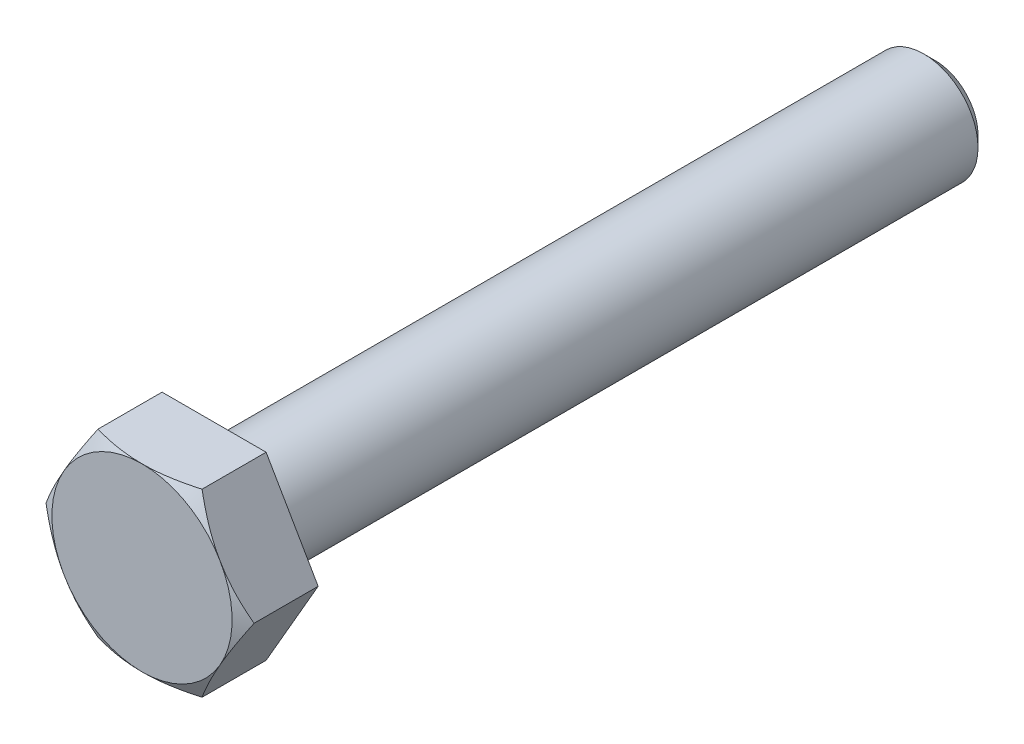
ISO-10303-21;
HEADER;
FILE_DESCRIPTION(('STEP AP214'),'2;1');
FILE_NAME('part.step','',(''),(''),'','','');
FILE_SCHEMA(('AUTOMOTIVE_DESIGN { 1 0 10303 214 1 1 1 1 }'));
ENDSEC;
DATA;
#1=APPLICATION_CONTEXT('core data for automotive mechanical design processes');
#2=APPLICATION_PROTOCOL_DEFINITION('international standard','automotive_design',2000,#1);
#3=PRODUCT_CONTEXT('',#1,'mechanical');
#4=PRODUCT('Part','Part','',(#3));
#5=PRODUCT_RELATED_PRODUCT_CATEGORY('part','',(#4));
#6=PRODUCT_DEFINITION_FORMATION('','',#4);
#7=PRODUCT_DEFINITION_CONTEXT('part definition',#1,'design');
#8=PRODUCT_DEFINITION('design','',#6,#7);
#9=PRODUCT_DEFINITION_SHAPE('','',#8);
#10=(LENGTH_UNIT() NAMED_UNIT(*) SI_UNIT(.MILLI.,.METRE.));
#11=(NAMED_UNIT(*) PLANE_ANGLE_UNIT() SI_UNIT($,.RADIAN.));
#12=(NAMED_UNIT(*) SI_UNIT($,.STERADIAN.) SOLID_ANGLE_UNIT());
#13=UNCERTAINTY_MEASURE_WITH_UNIT(LENGTH_MEASURE(1.E-05),#10,'distance_accuracy_value','');
#14=(GEOMETRIC_REPRESENTATION_CONTEXT(3) GLOBAL_UNCERTAINTY_ASSIGNED_CONTEXT((#13)) GLOBAL_UNIT_ASSIGNED_CONTEXT((#10,
#11,#12)) REPRESENTATION_CONTEXT('',''));
#15=CARTESIAN_POINT('',(0.,0.,0.));
#16=DIRECTION('',(0.,0.,1.));
#17=DIRECTION('',(1.,0.,0.));
#18=AXIS2_PLACEMENT_3D('',#15,#16,#17);
#19=CARTESIAN_POINT('',(-8.66025403784437,-5.,0.));
#20=DIRECTION('',(0.,0.,1.));
#21=DIRECTION('',(1.,0.,0.));
#22=AXIS2_PLACEMENT_3D('',#19,#20,#21);
#23=PLANE('',#22);
#24=CARTESIAN_POINT('',(0.,0.,0.));
#25=DIRECTION('',(0.,0.,1.));
#26=DIRECTION('',(1.,0.,0.));
#27=AXIS2_PLACEMENT_3D('',#24,#25,#26);
#28=CIRCLE('',#27,3.25);
#29=CARTESIAN_POINT('',(3.25,0.,0.));
#30=VERTEX_POINT('',#29);
#31=EDGE_CURVE('E11',#30,#30,#28,.T.);
#32=ORIENTED_EDGE('',*,*,#31,.T.);
#33=EDGE_LOOP('',(#32));
#34=FACE_BOUND('',#33,.T.);
#35=DIRECTION('',(-0.499999999999999,-0.866025403784439,0.));
#36=VECTOR('',#35,1.);
#37=CARTESIAN_POINT('',(-2.88675134594813,5.,0.));
#38=LINE('',#37,#36);
#39=CARTESIAN_POINT('',(-2.88675134594813,5.,0.));
#40=VERTEX_POINT('',#39);
#41=CARTESIAN_POINT('',(-5.77350269189626,0.,0.));
#42=VERTEX_POINT('',#41);
#43=EDGE_CURVE('E123',#40,#42,#38,.T.);
#44=ORIENTED_EDGE('',*,*,#43,.F.);
#45=DIRECTION('',(1.,0.,0.));
#46=VECTOR('',#45,1.);
#47=CARTESIAN_POINT('',(-2.88675134594813,5.,0.));
#48=LINE('',#47,#46);
#49=CARTESIAN_POINT('',(2.88675134594812,5.,0.));
#50=VERTEX_POINT('',#49);
#51=EDGE_CURVE('E255',#40,#50,#48,.T.);
#52=ORIENTED_EDGE('',*,*,#51,.T.);
#53=DIRECTION('',(0.5,-0.866025403784438,0.));
#54=VECTOR('',#53,1.);
#55=CARTESIAN_POINT('',(2.88675134594812,5.,0.));
#56=LINE('',#55,#54);
#57=CARTESIAN_POINT('',(5.77350269189626,0.,0.));
#58=VERTEX_POINT('',#57);
#59=EDGE_CURVE('E258',#50,#58,#56,.T.);
#60=ORIENTED_EDGE('',*,*,#59,.T.);
#61=DIRECTION('',(-0.5,-0.866025403784439,0.));
#62=VECTOR('',#61,1.);
#63=CARTESIAN_POINT('',(5.77350269189626,0.,0.));
#64=LINE('',#63,#62);
#65=CARTESIAN_POINT('',(2.88675134594813,-5.,0.));
#66=VERTEX_POINT('',#65);
#67=EDGE_CURVE('E261',#58,#66,#64,.T.);
#68=ORIENTED_EDGE('',*,*,#67,.T.);
#69=DIRECTION('',(1.,0.,0.));
#70=VECTOR('',#69,1.);
#71=CARTESIAN_POINT('',(-2.88675134594813,-5.,0.));
#72=LINE('',#71,#70);
#73=CARTESIAN_POINT('',(-2.88675134594813,-5.,0.));
#74=VERTEX_POINT('',#73);
#75=EDGE_CURVE('E246',#74,#66,#72,.T.);
#76=ORIENTED_EDGE('',*,*,#75,.F.);
#77=DIRECTION('',(0.5,-0.866025403784439,0.));
#78=VECTOR('',#77,1.);
#79=CARTESIAN_POINT('',(-5.77350269189626,0.,0.));
#80=LINE('',#79,#78);
#81=EDGE_CURVE('E264',#42,#74,#80,.T.);
#82=ORIENTED_EDGE('',*,*,#81,.F.);
#83=EDGE_LOOP('',(#44,#52,#60,#68,#76,#82));
#84=FACE_BOUND('',#83,.T.);
#85=ADVANCED_FACE('F31',(#34,#84),#23,.F.);
#86=CARTESIAN_POINT('',(-2.88675134594813,5.,4.));
#87=DIRECTION('',(0.866025403784439,-0.499999999999999,0.));
#88=DIRECTION('',(0.499999999999999,0.866025403784439,0.));
#89=AXIS2_PLACEMENT_3D('',#86,#87,#88);
#90=PLANE('',#89);
#91=DIRECTION('',(0.,0.,-1.));
#92=VECTOR('',#91,1.);
#93=CARTESIAN_POINT('',(-5.77350269189626,0.,4.));
#94=LINE('',#93,#92);
#95=CARTESIAN_POINT('',(-5.77350269189626,0.,3.5534180126148));
#96=VERTEX_POINT('',#95);
#97=EDGE_CURVE('E116',#96,#42,#94,.T.);
#98=ORIENTED_EDGE('',*,*,#97,.F.);
#99=CARTESIAN_POINT('',(-5.77361816195009,-0.000200000000005782,3.55335134394818));
#100=CARTESIAN_POINT('',(-5.6467543346507,0.219534594525179,3.62661343236237));
#101=CARTESIAN_POINT('',(-5.5188054379059,0.441148584459574,3.69324867808191));
#102=CARTESIAN_POINT('',(-5.26069210252318,0.888213995453507,3.80956100898919));
#103=CARTESIAN_POINT('',(-5.13052307794721,1.11367335959077,3.85919695008421));
#104=CARTESIAN_POINT('',(-4.87177839004641,1.5618323052235,3.9364489745813));
#105=CARTESIAN_POINT('',(-4.74324302208387,1.78446209310419,3.96457962171651));
#106=CARTESIAN_POINT('',(-4.54998783160117,2.11918990184663,3.98980507804631));
#107=CARTESIAN_POINT('',(-4.48552534905128,2.23084219680505,3.99538654023052));
#108=CARTESIAN_POINT('',(-4.35654081066911,2.45424997067379,4.00079778324853));
#109=CARTESIAN_POINT('',(-4.2920187567385,2.56600544629031,4.0006277417418));
#110=CARTESIAN_POINT('',(-4.11524635305245,2.87218423085063,3.99224636820796));
#111=CARTESIAN_POINT('',(-4.00305457769146,3.06650608596721,3.97817022810275));
#112=CARTESIAN_POINT('',(-3.77941563226458,3.4538601019977,3.93353474289057));
#113=CARTESIAN_POINT('',(-3.66796924828419,3.64689090137157,3.90296013985249));
#114=CARTESIAN_POINT('',(-3.44387972423144,4.03502534247485,3.82653150637884));
#115=CARTESIAN_POINT('',(-3.3312648659868,4.23007999864173,3.78035362112132));
#116=CARTESIAN_POINT('',(-3.10771464157941,4.61728034535877,3.67554820550807));
#117=CARTESIAN_POINT('',(-2.99677641204847,4.80943099540808,3.61694529656263));
#118=CARTESIAN_POINT('',(-2.88663587589429,5.0002,3.55335134394817));
#119=B_SPLINE_CURVE_WITH_KNOTS('',3,(#99,#100,#101,#102,#103,#104,#105,#106,#107,#108,#109,#110,
#111,#112,#113,#114,#115,#116,#117,#118),.UNSPECIFIED.,.F.,.F.,(4,2,2,2,2,2,2,2,2,4),(0.,
0.792555841363089,1.58701660053333,2.3618153748728,2.74884076077325,3.13585419177294,
3.80962362599679,4.48401723901189,5.17336882348928,5.86136694793725),.UNSPECIFIED.);
#120=CARTESIAN_POINT('',(-4.3301270189222,2.49999999999999,4.));
#121=VERTEX_POINT('',#120);
#122=EDGE_CURVE('E101',#96,#121,#119,.T.);
#123=ORIENTED_EDGE('',*,*,#122,.T.);
#124=CARTESIAN_POINT('',(-2.88675134594813,5.,3.5534180126148));
#125=VERTEX_POINT('',#124);
#126=EDGE_CURVE('E109',#121,#125,#119,.T.);
#127=ORIENTED_EDGE('',*,*,#126,.T.);
#128=DIRECTION('',(0.,0.,-1.));
#129=VECTOR('',#128,1.);
#130=CARTESIAN_POINT('',(-2.88675134594813,5.,4.));
#131=LINE('',#130,#129);
#132=EDGE_CURVE('E253',#125,#40,#131,.T.);
#133=ORIENTED_EDGE('',*,*,#132,.T.);
#134=ORIENTED_EDGE('',*,*,#43,.T.);
#135=EDGE_LOOP('',(#98,#123,#127,#133,#134));
#136=FACE_BOUND('',#135,.T.);
#137=ADVANCED_FACE('F121',(#136),#90,.F.);
#138=CARTESIAN_POINT('',(-5.77350269189626,0.,4.));
#139=DIRECTION('',(0.866025403784439,0.5,0.));
#140=DIRECTION('',(-0.5,0.866025403784439,0.));
#141=AXIS2_PLACEMENT_3D('',#138,#139,#140);
#142=PLANE('',#141);
#143=DIRECTION('',(0.,0.,-1.));
#144=VECTOR('',#143,1.);
#145=CARTESIAN_POINT('',(-2.88675134594813,-5.,4.));
#146=LINE('',#145,#144);
#147=CARTESIAN_POINT('',(-2.88675134594812,-5.,3.5534180126148));
#148=VERTEX_POINT('',#147);
#149=EDGE_CURVE('E125',#148,#74,#146,.T.);
#150=ORIENTED_EDGE('',*,*,#149,.F.);
#151=CARTESIAN_POINT('',(-2.88663587589429,-5.0002,3.55335134394817));
#152=CARTESIAN_POINT('',(-3.01349970319368,-4.78046540547482,3.62661343236237));
#153=CARTESIAN_POINT('',(-3.14144859993849,-4.55885141554042,3.69324867808191));
#154=CARTESIAN_POINT('',(-3.39956193532121,-4.11178600454649,3.80956100898919));
#155=CARTESIAN_POINT('',(-3.52973095989718,-3.88632664040923,3.85919695008421));
#156=CARTESIAN_POINT('',(-3.78847564779798,-3.43816769477649,3.9364489745813));
#157=CARTESIAN_POINT('',(-3.91701101576052,-3.21553790689581,3.96457962171651));
#158=CARTESIAN_POINT('',(-4.11026620624322,-2.88081009815336,3.98980507804631));
#159=CARTESIAN_POINT('',(-4.17472868879311,-2.76915780319494,3.99538654023051));
#160=CARTESIAN_POINT('',(-4.30371322717528,-2.54575002932621,4.00079778324853));
#161=CARTESIAN_POINT('',(-4.36823528110589,-2.43399455370969,4.00062774174179));
#162=CARTESIAN_POINT('',(-4.54500768479194,-2.12781576914936,3.99224636820796));
#163=CARTESIAN_POINT('',(-4.65719946015292,-1.93349391403279,3.97817022810275));
#164=CARTESIAN_POINT('',(-4.88083840557981,-1.5461398980023,3.93353474289057));
#165=CARTESIAN_POINT('',(-4.9922847895602,-1.35310909862843,3.90296013985249));
#166=CARTESIAN_POINT('',(-5.21637431361295,-0.96497465752515,3.82653150637884));
#167=CARTESIAN_POINT('',(-5.32898917185759,-0.769920001358269,3.78035362112132));
#168=CARTESIAN_POINT('',(-5.55253939626498,-0.382719654641237,3.67554820550807));
#169=CARTESIAN_POINT('',(-5.66347762579591,-0.190569004591919,3.61694529656263));
#170=CARTESIAN_POINT('',(-5.77361816195009,0.000199999999993787,3.55335134394818));
#171=B_SPLINE_CURVE_WITH_KNOTS('',3,(#151,#152,#153,#154,#155,#156,#157,#158,#159,#160,#161,
#162,#163,#164,#165,#166,#167,#168,#169,#170),.UNSPECIFIED.,.F.,.F.,(4,2,2,2,2,2,2,2,2,4),(0.,
0.79255584136309,1.58701660053333,2.3618153748728,2.74884076077325,3.13585419177295,
3.80962362599679,4.48401723901189,5.17336882348928,5.86136694793725),.UNSPECIFIED.);
#172=CARTESIAN_POINT('',(-4.33012701892219,-2.5,4.));
#173=VERTEX_POINT('',#172);
#174=EDGE_CURVE('E118',#148,#173,#171,.T.);
#175=ORIENTED_EDGE('',*,*,#174,.T.);
#176=EDGE_CURVE('E54',#173,#96,#171,.T.);
#177=ORIENTED_EDGE('',*,*,#176,.T.);
#178=ORIENTED_EDGE('',*,*,#97,.T.);
#179=ORIENTED_EDGE('',*,*,#81,.T.);
#180=EDGE_LOOP('',(#150,#175,#177,#178,#179));
#181=FACE_BOUND('',#180,.T.);
#182=ADVANCED_FACE('F114',(#181),#142,.F.);
#183=CARTESIAN_POINT('',(-2.88675134594813,-5.,4.));
#184=DIRECTION('',(0.,1.,0.));
#185=DIRECTION('',(0.,0.,1.));
#186=AXIS2_PLACEMENT_3D('',#183,#184,#185);
#187=PLANE('',#186);
#188=DIRECTION('',(0.,0.,-1.));
#189=VECTOR('',#188,1.);
#190=CARTESIAN_POINT('',(2.88675134594813,-5.,4.));
#191=LINE('',#190,#189);
#192=CARTESIAN_POINT('',(2.88675134594813,-5.,3.5534180126148));
#193=VERTEX_POINT('',#192);
#194=EDGE_CURVE('E131',#193,#66,#191,.T.);
#195=ORIENTED_EDGE('',*,*,#194,.F.);
#196=CARTESIAN_POINT('',(-7.65608998744865,-5.,1.60736647344924));
#197=CARTESIAN_POINT('',(-7.43656171400166,-5.,1.71345466182796));
#198=CARTESIAN_POINT('',(-7.21651440170021,-5.,1.81848824538408));
#199=CARTESIAN_POINT('',(-6.77510105921518,-5.,2.02584356636027));
#200=CARTESIAN_POINT('',(-6.55373480873052,-5.,2.12816483425435));
#201=CARTESIAN_POINT('',(-6.10820714710356,-5.,2.33003192146512));
#202=CARTESIAN_POINT('',(-5.88403698971124,-5.,2.42955850718272));
#203=CARTESIAN_POINT('',(-5.43385418074676,-5.,2.62433676721321));
#204=CARTESIAN_POINT('',(-5.20784162594277,-5.,2.71958866435759));
#205=CARTESIAN_POINT('',(-4.75080884782755,-5.,2.90581169081061));
#206=CARTESIAN_POINT('',(-4.51976121099505,-5.,2.99671590900132));
#207=CARTESIAN_POINT('',(-4.05494053422099,-5.,3.17140469702806));
#208=CARTESIAN_POINT('',(-3.82116719434024,-5.,3.25518847475236));
#209=CARTESIAN_POINT('',(-3.35100416711888,-5.,3.41338536763539));
#210=CARTESIAN_POINT('',(-3.11462125088187,-5.,3.48781840477474));
#211=CARTESIAN_POINT('',(-2.63849247870023,-5.,3.62489560612763));
#212=CARTESIAN_POINT('',(-2.3987477121033,-5.,3.68754349840305));
#213=CARTESIAN_POINT('',(-1.91574303714497,-5.,3.79801224600513));
#214=CARTESIAN_POINT('',(-1.672482210841,-5.,3.84582915344136));
#215=CARTESIAN_POINT('',(-1.18299359688664,-5.,3.9234044442076));
#216=CARTESIAN_POINT('',(-0.93676580661328,-5.,3.95316281157159));
#217=CARTESIAN_POINT('',(-0.567032279323847,-5.,3.9823487984137));
#218=CARTESIAN_POINT('',(-0.44410529765854,-5.,3.98950368094005));
#219=CARTESIAN_POINT('',(-0.198053005238565,-5.,3.99860454773096));
#220=CARTESIAN_POINT('',(-0.0749276970802291,-5.,4.00055059963961));
#221=CARTESIAN_POINT('',(0.171257999892353,-5.,3.99918152965433));
#222=CARTESIAN_POINT('',(0.294318397227088,-5.,3.99586788568699));
#223=CARTESIAN_POINT('',(0.54019273078884,-5.,3.98406340271724));
#224=CARTESIAN_POINT('',(0.663006654263483,-5.,3.97557230242983));
#225=CARTESIAN_POINT('',(0.96068187288167,-5.,3.9488936197247));
#226=CARTESIAN_POINT('',(1.1353143627994,-5.,3.92811103230171));
#227=CARTESIAN_POINT('',(1.4832167579939,-5.,3.8772343442773));
#228=CARTESIAN_POINT('',(1.65648647841238,-5.,3.84713900200996));
#229=CARTESIAN_POINT('',(2.00155426058702,-5.,3.77870120798844));
#230=CARTESIAN_POINT('',(2.17335067370376,-5.,3.74035052251359));
#231=CARTESIAN_POINT('',(2.51518168221058,-5.,3.65657169461498));
#232=CARTESIAN_POINT('',(2.68521638419315,-5.,3.61114398308599));
#233=CARTESIAN_POINT('',(3.02770318928897,-5.,3.5131122179457));
#234=CARTESIAN_POINT('',(3.20011248435317,-5.,3.46035963617605));
#235=CARTESIAN_POINT('',(3.54310870430183,-5.,3.34964221269736));
#236=CARTESIAN_POINT('',(3.71369679659721,-5.,3.29168096609292));
#237=CARTESIAN_POINT('',(4.0523661026798,-5.,3.17174345927151));
#238=CARTESIAN_POINT('',(4.22045602230063,-5.,3.10979163457362));
#239=CARTESIAN_POINT('',(4.55533171687456,-5.,2.98225176586186));
#240=CARTESIAN_POINT('',(4.72211693321423,-5.,2.91666225221221));
#241=CARTESIAN_POINT('',(4.88829623733364,-5.,2.84961374182274));
#242=B_SPLINE_CURVE_WITH_KNOTS('',3,(#196,#197,#198,#199,#200,#201,#202,#203,#204,#205,#206,
#207,#208,#209,#210,#211,#212,#213,#214,#215,#216,#217,#218,#219,#220,#221,#222,#223,#224,#225,
#226,#227,#228,#229,#230,#231,#232,#233,#234,#235,#236,#237,#238,#239,#240,#241),.UNSPECIFIED.,
.F.,.F.,(4,2,2,2,2,2,2,2,2,2,2,2,2,2,2,2,2,2,2,2,2,2,4),(0.,0.73146474066535,1.46305528824908,
2.19883243307486,2.93457117856033,3.67934251246857,4.42419659013361,5.16743580871988,
5.91043951739337,6.65364083834805,7.39684281638514,7.76615414335455,8.13546067426609,
8.50466345177854,8.87388486298451,9.40118542949727,9.92855633110016,10.4564556797854,
10.9843228991235,11.5251202808281,12.0655472210641,12.6029322754131,13.1405360390026),.UNSPECIFIED.);
#243=CARTESIAN_POINT('',(0.,-5.,4.));
#244=VERTEX_POINT('',#243);
#245=EDGE_CURVE('E208',#193,#244,#242,.F.);
#246=ORIENTED_EDGE('',*,*,#245,.T.);
#247=EDGE_CURVE('E46',#244,#148,#242,.F.);
#248=ORIENTED_EDGE('',*,*,#247,.T.);
#249=ORIENTED_EDGE('',*,*,#149,.T.);
#250=ORIENTED_EDGE('',*,*,#75,.T.);
#251=EDGE_LOOP('',(#195,#246,#248,#249,#250));
#252=FACE_BOUND('',#251,.T.);
#253=ADVANCED_FACE('F224',(#252),#187,.F.);
#254=CARTESIAN_POINT('',(5.77350269189626,0.,4.));
#255=DIRECTION('',(0.866025403784439,-0.5,0.));
#256=DIRECTION('',(0.5,0.866025403784439,0.));
#257=AXIS2_PLACEMENT_3D('',#254,#255,#256);
#258=PLANE('',#257);
#259=CARTESIAN_POINT('',(2.88663587589429,-5.0002,3.55335134394817));
#260=CARTESIAN_POINT('',(3.01349970319368,-4.78046540547482,3.62661343236237));
#261=CARTESIAN_POINT('',(3.14144859993849,-4.55885141554042,3.69324867808191));
#262=CARTESIAN_POINT('',(3.39956193532121,-4.11178600454649,3.80956100898919));
#263=CARTESIAN_POINT('',(3.52973095989718,-3.88632664040923,3.85919695008421));
#264=CARTESIAN_POINT('',(3.78847564779797,-3.43816769477649,3.9364489745813));
#265=CARTESIAN_POINT('',(3.91701101576052,-3.21553790689581,3.96457962171651));
#266=CARTESIAN_POINT('',(4.11026620624322,-2.88081009815336,3.98980507804632));
#267=CARTESIAN_POINT('',(4.1747286887931,-2.76915780319494,3.99538654023052));
#268=CARTESIAN_POINT('',(4.30371322717527,-2.54575002932621,4.00079778324853));
#269=CARTESIAN_POINT('',(4.36823528110588,-2.43399455370969,4.0006277417418));
#270=CARTESIAN_POINT('',(4.54500768479194,-2.12781576914936,3.99224636820796));
#271=CARTESIAN_POINT('',(4.65719946015292,-1.93349391403279,3.97817022810275));
#272=CARTESIAN_POINT('',(4.88083840557981,-1.5461398980023,3.93353474289057));
#273=CARTESIAN_POINT('',(4.9922847895602,-1.35310909862843,3.90296013985249));
#274=CARTESIAN_POINT('',(5.21637431361295,-0.964974657525147,3.82653150637884));
#275=CARTESIAN_POINT('',(5.32898917185758,-0.769920001358266,3.78035362112132));
#276=CARTESIAN_POINT('',(5.55253939626498,-0.382719654641233,3.67554820550807));
#277=CARTESIAN_POINT('',(5.66347762579591,-0.190569004591914,3.61694529656263));
#278=CARTESIAN_POINT('',(5.77361816195009,0.000199999999999473,3.55335134394818));
#279=B_SPLINE_CURVE_WITH_KNOTS('',3,(#259,#260,#261,#262,#263,#264,#265,#266,#267,#268,#269,
#270,#271,#272,#273,#274,#275,#276,#277,#278),.UNSPECIFIED.,.F.,.F.,(4,2,2,2,2,2,2,2,2,4),(0.,
0.792555841363091,1.58701660053333,2.3618153748728,2.74884076077325,3.13585419177295,
3.80962362599679,4.48401723901189,5.17336882348928,5.86136694793725),.UNSPECIFIED.);
#280=CARTESIAN_POINT('',(4.33012701892219,-2.5,4.));
#281=VERTEX_POINT('',#280);
#282=EDGE_CURVE('E238',#193,#281,#279,.T.);
#283=ORIENTED_EDGE('',*,*,#282,.F.);
#284=ORIENTED_EDGE('',*,*,#194,.T.);
#285=ORIENTED_EDGE('',*,*,#67,.F.);
#286=DIRECTION('',(0.,0.,-1.));
#287=VECTOR('',#286,1.);
#288=CARTESIAN_POINT('',(5.77350269189626,0.,4.));
#289=LINE('',#288,#287);
#290=CARTESIAN_POINT('',(5.77350269189626,0.,3.5534180126148));
#291=VERTEX_POINT('',#290);
#292=EDGE_CURVE('E248',#291,#58,#289,.T.);
#293=ORIENTED_EDGE('',*,*,#292,.F.);
#294=EDGE_CURVE('E203',#281,#291,#279,.T.);
#295=ORIENTED_EDGE('',*,*,#294,.F.);
#296=EDGE_LOOP('',(#283,#284,#285,#293,#295));
#297=FACE_BOUND('',#296,.T.);
#298=ADVANCED_FACE('F227',(#297),#258,.T.);
#299=CARTESIAN_POINT('',(2.88675134594812,5.,4.));
#300=DIRECTION('',(0.866025403784438,0.5,0.));
#301=DIRECTION('',(-0.5,0.866025403784438,0.));
#302=AXIS2_PLACEMENT_3D('',#299,#300,#301);
#303=PLANE('',#302);
#304=CARTESIAN_POINT('',(5.77361816195009,-0.000200000000000131,3.55335134394818));
#305=CARTESIAN_POINT('',(5.6467543346507,0.219534594525185,3.62661343236237));
#306=CARTESIAN_POINT('',(5.51880543790589,0.44114858445958,3.69324867808191));
#307=CARTESIAN_POINT('',(5.26069210252318,0.888213995453511,3.80956100898919));
#308=CARTESIAN_POINT('',(5.13052307794721,1.11367335959077,3.85919695008421));
#309=CARTESIAN_POINT('',(4.87177839004641,1.56183230522351,3.9364489745813));
#310=CARTESIAN_POINT('',(4.74324302208387,1.78446209310419,3.96457962171651));
#311=CARTESIAN_POINT('',(4.54998783160116,2.11918990184664,3.98980507804632));
#312=CARTESIAN_POINT('',(4.48552534905128,2.23084219680506,3.99538654023052));
#313=CARTESIAN_POINT('',(4.35654081066911,2.45424997067379,4.00079778324853));
#314=CARTESIAN_POINT('',(4.2920187567385,2.56600544629031,4.0006277417418));
#315=CARTESIAN_POINT('',(4.11524635305244,2.87218423085063,3.99224636820796));
#316=CARTESIAN_POINT('',(4.00305457769146,3.06650608596721,3.97817022810275));
#317=CARTESIAN_POINT('',(3.77941563226457,3.4538601019977,3.93353474289057));
#318=CARTESIAN_POINT('',(3.66796924828418,3.64689090137157,3.90296013985249));
#319=CARTESIAN_POINT('',(3.44387972423144,4.03502534247485,3.82653150637884));
#320=CARTESIAN_POINT('',(3.3312648659868,4.23007999864173,3.78035362112132));
#321=CARTESIAN_POINT('',(3.1077146415794,4.61728034535877,3.67554820550807));
#322=CARTESIAN_POINT('',(2.99677641204847,4.80943099540808,3.61694529656263));
#323=CARTESIAN_POINT('',(2.88663587589429,5.0002,3.55335134394818));
#324=B_SPLINE_CURVE_WITH_KNOTS('',3,(#304,#305,#306,#307,#308,#309,#310,#311,#312,#313,#314,
#315,#316,#317,#318,#319,#320,#321,#322,#323),.UNSPECIFIED.,.F.,.F.,(4,2,2,2,2,2,2,2,2,4),(0.,
0.792555841363089,1.58701660053333,2.3618153748728,2.74884076077325,3.13585419177294,
3.80962362599679,4.48401723901189,5.17336882348928,5.86136694793725),.UNSPECIFIED.);
#325=CARTESIAN_POINT('',(4.33012701892219,2.5,4.));
#326=VERTEX_POINT('',#325);
#327=EDGE_CURVE('E270',#291,#326,#324,.T.);
#328=ORIENTED_EDGE('',*,*,#327,.F.);
#329=ORIENTED_EDGE('',*,*,#292,.T.);
#330=ORIENTED_EDGE('',*,*,#59,.F.);
#331=DIRECTION('',(0.,0.,-1.));
#332=VECTOR('',#331,1.);
#333=CARTESIAN_POINT('',(2.88675134594812,5.,4.));
#334=LINE('',#333,#332);
#335=CARTESIAN_POINT('',(2.88675134594813,5.,3.5534180126148));
#336=VERTEX_POINT('',#335);
#337=EDGE_CURVE('E249',#336,#50,#334,.T.);
#338=ORIENTED_EDGE('',*,*,#337,.F.);
#339=EDGE_CURVE('E185',#326,#336,#324,.T.);
#340=ORIENTED_EDGE('',*,*,#339,.F.);
#341=EDGE_LOOP('',(#328,#329,#330,#338,#340));
#342=FACE_BOUND('',#341,.T.);
#343=ADVANCED_FACE('F172',(#342),#303,.T.);
#344=CARTESIAN_POINT('',(-2.88675134594813,5.,4.));
#345=DIRECTION('',(0.,1.,0.));
#346=DIRECTION('',(0.,0.,1.));
#347=AXIS2_PLACEMENT_3D('',#344,#345,#346);
#348=PLANE('',#347);
#349=CARTESIAN_POINT('',(-7.65608998744865,5.,1.60736647344924));
#350=CARTESIAN_POINT('',(-7.43656171400166,5.,1.71345466182797));
#351=CARTESIAN_POINT('',(-7.21651440170021,5.,1.81848824538408));
#352=CARTESIAN_POINT('',(-6.77510105921518,5.,2.02584356636027));
#353=CARTESIAN_POINT('',(-6.55373480873052,5.,2.12816483425435));
#354=CARTESIAN_POINT('',(-6.10820714710357,5.,2.33003192146512));
#355=CARTESIAN_POINT('',(-5.88403698971124,5.,2.42955850718272));
#356=CARTESIAN_POINT('',(-5.43385418074677,5.,2.62433676721321));
#357=CARTESIAN_POINT('',(-5.20784162594278,5.,2.71958866435759));
#358=CARTESIAN_POINT('',(-4.75080884782756,5.,2.9058116908106));
#359=CARTESIAN_POINT('',(-4.51976121099505,5.,2.99671590900132));
#360=CARTESIAN_POINT('',(-4.05494053422099,5.,3.17140469702806));
#361=CARTESIAN_POINT('',(-3.82116719434024,5.,3.25518847475236));
#362=CARTESIAN_POINT('',(-3.35100416711889,5.,3.41338536763539));
#363=CARTESIAN_POINT('',(-3.11462125088188,5.,3.48781840477474));
#364=CARTESIAN_POINT('',(-2.63849247870023,5.,3.62489560612763));
#365=CARTESIAN_POINT('',(-2.3987477121033,5.,3.68754349840306));
#366=CARTESIAN_POINT('',(-1.91574303714497,5.,3.79801224600513));
#367=CARTESIAN_POINT('',(-1.672482210841,5.,3.84582915344136));
#368=CARTESIAN_POINT('',(-1.18299359688664,5.,3.9234044442076));
#369=CARTESIAN_POINT('',(-0.936765806613282,5.,3.95316281157159));
#370=CARTESIAN_POINT('',(-0.56703227932385,5.,3.9823487984137));
#371=CARTESIAN_POINT('',(-0.444105297658542,5.,3.98950368094005));
#372=CARTESIAN_POINT('',(-0.198053005238569,5.,3.99860454773096));
#373=CARTESIAN_POINT('',(-0.0749276970802328,5.,4.00055059963961));
#374=CARTESIAN_POINT('',(0.171257999892348,5.,3.99918152965434));
#375=CARTESIAN_POINT('',(0.294318397227083,5.,3.99586788568699));
#376=CARTESIAN_POINT('',(0.540192730788835,5.,3.98406340271724));
#377=CARTESIAN_POINT('',(0.663006654263477,5.,3.97557230242984));
#378=CARTESIAN_POINT('',(0.960681872881664,5.,3.9488936197247));
#379=CARTESIAN_POINT('',(1.1353143627994,5.,3.92811103230171));
#380=CARTESIAN_POINT('',(1.4832167579939,5.,3.87723434427731));
#381=CARTESIAN_POINT('',(1.65648647841237,5.,3.84713900200997));
#382=CARTESIAN_POINT('',(2.00155426058701,5.,3.77870120798845));
#383=CARTESIAN_POINT('',(2.17335067370375,5.,3.74035052251359));
#384=CARTESIAN_POINT('',(2.51518168221057,5.,3.65657169461499));
#385=CARTESIAN_POINT('',(2.68521638419313,5.,3.611143983086));
#386=CARTESIAN_POINT('',(3.02770318928895,5.,3.5131122179457));
#387=CARTESIAN_POINT('',(3.20011248435316,5.,3.46035963617605));
#388=CARTESIAN_POINT('',(3.54310870430181,5.,3.34964221269737));
#389=CARTESIAN_POINT('',(3.71369679659719,5.,3.29168096609292));
#390=CARTESIAN_POINT('',(4.05236610267979,5.,3.17174345927152));
#391=CARTESIAN_POINT('',(4.22045602230062,5.,3.10979163457363));
#392=CARTESIAN_POINT('',(4.55533171687455,5.,2.98225176586187));
#393=CARTESIAN_POINT('',(4.72211693321421,5.,2.91666225221222));
#394=CARTESIAN_POINT('',(4.88829623733363,5.,2.84961374182275));
#395=B_SPLINE_CURVE_WITH_KNOTS('',3,(#349,#350,#351,#352,#353,#354,#355,#356,#357,#358,#359,
#360,#361,#362,#363,#364,#365,#366,#367,#368,#369,#370,#371,#372,#373,#374,#375,#376,#377,#378,
#379,#380,#381,#382,#383,#384,#385,#386,#387,#388,#389,#390,#391,#392,#393,#394),.UNSPECIFIED.,
.F.,.F.,(4,2,2,2,2,2,2,2,2,2,2,2,2,2,2,2,2,2,2,2,2,2,4),(0.,0.73146474066535,1.46305528824908,
2.19883243307485,2.93457117856033,3.67934251246857,4.4241965901336,5.16743580871988,
5.91043951739337,6.65364083834805,7.39684281638514,7.76615414335454,8.13546067426608,
8.50466345177854,8.8738848629845,9.40118542949726,9.92855633110014,10.4564556797854,
10.9843228991235,11.525120280828,12.065547221064,12.6029322754131,13.1405360390026),.UNSPECIFIED.);
#396=CARTESIAN_POINT('',(0.,5.,4.));
#397=VERTEX_POINT('',#396);
#398=EDGE_CURVE('E183',#336,#397,#395,.F.);
#399=ORIENTED_EDGE('',*,*,#398,.F.);
#400=ORIENTED_EDGE('',*,*,#337,.T.);
#401=ORIENTED_EDGE('',*,*,#51,.F.);
#402=ORIENTED_EDGE('',*,*,#132,.F.);
#403=EDGE_CURVE('E177',#397,#125,#395,.F.);
#404=ORIENTED_EDGE('',*,*,#403,.F.);
#405=EDGE_LOOP('',(#399,#400,#401,#402,#404));
#406=FACE_BOUND('',#405,.T.);
#407=ADVANCED_FACE('F167',(#406),#348,.T.);
#408=CARTESIAN_POINT('',(0.,0.,4.));
#409=DIRECTION('',(0.,0.,-1.));
#410=DIRECTION('',(-1.,0.,0.));
#411=AXIS2_PLACEMENT_3D('',#408,#409,#410);
#412=CONICAL_SURFACE('',#411,5.,1.0471975511966);
#413=ORIENTED_EDGE('',*,*,#294,.T.);
#414=ORIENTED_EDGE('',*,*,#327,.T.);
#415=CARTESIAN_POINT('',(0.,0.,4.));
#416=DIRECTION('',(0.,0.,1.));
#417=DIRECTION('',(1.,0.,0.));
#418=AXIS2_PLACEMENT_3D('',#415,#416,#417);
#419=CIRCLE('',#418,5.);
#420=EDGE_CURVE('E124',#326,#281,#419,.F.);
#421=ORIENTED_EDGE('',*,*,#420,.T.);
#422=EDGE_LOOP('',(#413,#414,#421));
#423=FACE_BOUND('',#422,.T.);
#424=ADVANCED_FACE('F171',(#423),#412,.T.);
#425=ORIENTED_EDGE('',*,*,#339,.T.);
#426=ORIENTED_EDGE('',*,*,#398,.T.);
#427=EDGE_CURVE('E128',#397,#326,#419,.F.);
#428=ORIENTED_EDGE('',*,*,#427,.T.);
#429=EDGE_LOOP('',(#425,#426,#428));
#430=FACE_BOUND('',#429,.T.);
#431=ADVANCED_FACE('F190',(#430),#412,.T.);
#432=CARTESIAN_POINT('',(0.,0.,4.));
#433=DIRECTION('',(0.,0.,-1.));
#434=DIRECTION('',(-1.,0.,0.));
#435=AXIS2_PLACEMENT_3D('',#432,#433,#434);
#436=CIRCLE('',#435,5.);
#437=EDGE_CURVE('E184',#121,#397,#436,.T.);
#438=ORIENTED_EDGE('',*,*,#437,.T.);
#439=ORIENTED_EDGE('',*,*,#403,.T.);
#440=ORIENTED_EDGE('',*,*,#126,.F.);
#441=EDGE_LOOP('',(#438,#439,#440));
#442=FACE_BOUND('',#441,.T.);
#443=ADVANCED_FACE('F194',(#442),#412,.T.);
#444=EDGE_CURVE('E104',#173,#121,#419,.F.);
#445=ORIENTED_EDGE('',*,*,#444,.T.);
#446=ORIENTED_EDGE('',*,*,#122,.F.);
#447=ORIENTED_EDGE('',*,*,#176,.F.);
#448=EDGE_LOOP('',(#445,#446,#447));
#449=FACE_BOUND('',#448,.T.);
#450=ADVANCED_FACE('F102',(#449),#412,.T.);
#451=ORIENTED_EDGE('',*,*,#247,.F.);
#452=EDGE_CURVE('E283',#244,#173,#419,.F.);
#453=ORIENTED_EDGE('',*,*,#452,.T.);
#454=ORIENTED_EDGE('',*,*,#174,.F.);
#455=EDGE_LOOP('',(#451,#453,#454));
#456=FACE_BOUND('',#455,.T.);
#457=ADVANCED_FACE('F196',(#456),#412,.T.);
#458=ORIENTED_EDGE('',*,*,#282,.T.);
#459=EDGE_CURVE('E130',#281,#244,#419,.F.);
#460=ORIENTED_EDGE('',*,*,#459,.T.);
#461=ORIENTED_EDGE('',*,*,#245,.F.);
#462=EDGE_LOOP('',(#458,#460,#461));
#463=FACE_BOUND('',#462,.T.);
#464=ADVANCED_FACE('F284',(#463),#412,.T.);
#465=CARTESIAN_POINT('',(-8.66025403784437,-5.,4.));
#466=DIRECTION('',(0.,0.,1.));
#467=DIRECTION('',(1.,0.,0.));
#468=AXIS2_PLACEMENT_3D('',#465,#466,#467);
#469=PLANE('',#468);
#470=ORIENTED_EDGE('',*,*,#459,.F.);
#471=ORIENTED_EDGE('',*,*,#420,.F.);
#472=ORIENTED_EDGE('',*,*,#427,.F.);
#473=ORIENTED_EDGE('',*,*,#437,.F.);
#474=ORIENTED_EDGE('',*,*,#444,.F.);
#475=ORIENTED_EDGE('',*,*,#452,.F.);
#476=EDGE_LOOP('',(#470,#471,#472,#473,#474,#475));
#477=FACE_BOUND('',#476,.T.);
#478=ADVANCED_FACE('F165',(#477),#469,.T.);
#479=CARTESIAN_POINT('',(0.,0.,-40.));
#480=DIRECTION('',(0.,0.,1.));
#481=DIRECTION('',(1.,0.,0.));
#482=AXIS2_PLACEMENT_3D('',#479,#480,#481);
#483=CYLINDRICAL_SURFACE('',#482,3.);
#484=CARTESIAN_POINT('',(0.,0.,-0.25));
#485=DIRECTION('',(0.,0.,1.));
#486=DIRECTION('',(1.,0.,0.));
#487=AXIS2_PLACEMENT_3D('',#484,#485,#486);
#488=CIRCLE('',#487,3.);
#489=CARTESIAN_POINT('',(3.,0.,-0.25));
#490=VERTEX_POINT('',#489);
#491=EDGE_CURVE('E39',#490,#490,#488,.F.);
#492=ORIENTED_EDGE('',*,*,#491,.T.);
#493=EDGE_LOOP('',(#492));
#494=FACE_BOUND('',#493,.T.);
#495=CARTESIAN_POINT('',(0.,0.,-39.3866));
#496=DIRECTION('',(0.,0.,-1.));
#497=DIRECTION('',(-1.,0.,0.));
#498=AXIS2_PLACEMENT_3D('',#495,#496,#497);
#499=CIRCLE('',#498,3.);
#500=CARTESIAN_POINT('',(3.,0.,-39.3866));
#501=VERTEX_POINT('',#500);
#502=EDGE_CURVE('E138',#501,#501,#499,.F.);
#503=ORIENTED_EDGE('',*,*,#502,.T.);
#504=EDGE_LOOP('',(#503));
#505=FACE_BOUND('',#504,.T.);
#506=ADVANCED_FACE('F143',(#494,#505),#483,.T.);
#507=CARTESIAN_POINT('',(0.,0.,-40.));
#508=DIRECTION('',(0.,0.,-1.));
#509=DIRECTION('',(-1.,0.,0.));
#510=AXIS2_PLACEMENT_3D('',#507,#508,#509);
#511=PLANE('',#510);
#512=CARTESIAN_POINT('',(0.,0.,-40.));
#513=DIRECTION('',(0.,0.,-1.));
#514=DIRECTION('',(-1.,0.,0.));
#515=AXIS2_PLACEMENT_3D('',#512,#513,#514);
#516=CIRCLE('',#515,2.38659999999999);
#517=CARTESIAN_POINT('',(2.38659999999999,0.,-40.));
#518=VERTEX_POINT('',#517);
#519=EDGE_CURVE('E135',#518,#518,#516,.T.);
#520=ORIENTED_EDGE('',*,*,#519,.T.);
#521=EDGE_LOOP('',(#520));
#522=FACE_BOUND('',#521,.T.);
#523=ADVANCED_FACE('F152',(#522),#511,.T.);
#524=CARTESIAN_POINT('',(0.,0.,-40.));
#525=DIRECTION('',(0.,0.,1.));
#526=DIRECTION('',(1.,0.,0.));
#527=AXIS2_PLACEMENT_3D('',#524,#525,#526);
#528=CONICAL_SURFACE('',#527,2.38659999999999,0.785398163397451);
#529=CARTESIAN_POINT('',(3.,0.,-39.3866));
#530=CARTESIAN_POINT('',(2.99361041666667,0.,-39.3929895833333));
#531=CARTESIAN_POINT('',(2.98722083333334,0.,-39.3993791666667));
#532=CARTESIAN_POINT('',(2.97444166666667,0.,-39.4121583333333));
#533=CARTESIAN_POINT('',(2.96805208333334,0.,-39.4185479166667));
#534=CARTESIAN_POINT('',(2.95527291666667,0.,-39.4313270833333));
#535=CARTESIAN_POINT('',(2.94888333333334,0.,-39.4377166666667));
#536=CARTESIAN_POINT('',(2.93610416666667,0.,-39.4504958333333));
#537=CARTESIAN_POINT('',(2.92971458333334,0.,-39.4568854166667));
#538=CARTESIAN_POINT('',(2.91693541666667,0.,-39.4696645833333));
#539=CARTESIAN_POINT('',(2.91054583333334,0.,-39.4760541666667));
#540=CARTESIAN_POINT('',(2.89776666666667,0.,-39.4888333333333));
#541=CARTESIAN_POINT('',(2.89137708333334,0.,-39.4952229166667));
#542=CARTESIAN_POINT('',(2.87859791666667,0.,-39.5080020833333));
#543=CARTESIAN_POINT('',(2.87220833333334,0.,-39.5143916666667));
#544=CARTESIAN_POINT('',(2.85942916666667,0.,-39.5271708333333));
#545=CARTESIAN_POINT('',(2.85303958333333,0.,-39.5335604166667));
#546=CARTESIAN_POINT('',(2.84026041666667,0.,-39.5463395833333));
#547=CARTESIAN_POINT('',(2.83387083333333,0.,-39.5527291666667));
#548=CARTESIAN_POINT('',(2.82109166666667,0.,-39.5655083333333));
#549=CARTESIAN_POINT('',(2.81470208333333,0.,-39.5718979166667));
#550=CARTESIAN_POINT('',(2.80192291666667,0.,-39.5846770833333));
#551=CARTESIAN_POINT('',(2.79553333333333,0.,-39.5910666666667));
#552=CARTESIAN_POINT('',(2.78275416666667,0.,-39.6038458333333));
#553=CARTESIAN_POINT('',(2.77636458333333,0.,-39.6102354166667));
#554=CARTESIAN_POINT('',(2.76358541666667,0.,-39.6230145833333));
#555=CARTESIAN_POINT('',(2.75719583333333,0.,-39.6294041666667));
#556=CARTESIAN_POINT('',(2.74441666666667,0.,-39.6421833333333));
#557=CARTESIAN_POINT('',(2.73802708333333,0.,-39.6485729166667));
#558=CARTESIAN_POINT('',(2.72524791666667,0.,-39.6613520833333));
#559=CARTESIAN_POINT('',(2.71885833333333,0.,-39.6677416666667));
#560=CARTESIAN_POINT('',(2.70607916666667,0.,-39.6805208333333));
#561=CARTESIAN_POINT('',(2.69968958333333,0.,-39.6869104166667));
#562=CARTESIAN_POINT('',(2.68691041666667,0.,-39.6996895833333));
#563=CARTESIAN_POINT('',(2.68052083333333,0.,-39.7060791666667));
#564=CARTESIAN_POINT('',(2.66774166666666,0.,-39.7188583333333));
#565=CARTESIAN_POINT('',(2.66135208333333,0.,-39.7252479166667));
#566=CARTESIAN_POINT('',(2.64857291666666,0.,-39.7380270833333));
#567=CARTESIAN_POINT('',(2.64218333333333,0.,-39.7444166666667));
#568=CARTESIAN_POINT('',(2.62940416666666,0.,-39.7571958333333));
#569=CARTESIAN_POINT('',(2.62301458333333,0.,-39.7635854166667));
#570=CARTESIAN_POINT('',(2.61023541666666,0.,-39.7763645833333));
#571=CARTESIAN_POINT('',(2.60384583333333,0.,-39.7827541666667));
#572=CARTESIAN_POINT('',(2.59106666666666,0.,-39.7955333333333));
#573=CARTESIAN_POINT('',(2.58467708333333,0.,-39.8019229166667));
#574=CARTESIAN_POINT('',(2.57189791666666,0.,-39.8147020833333));
#575=CARTESIAN_POINT('',(2.56550833333333,0.,-39.8210916666667));
#576=CARTESIAN_POINT('',(2.55272916666666,0.,-39.8338708333333));
#577=CARTESIAN_POINT('',(2.54633958333333,0.,-39.8402604166667));
#578=CARTESIAN_POINT('',(2.53356041666666,0.,-39.8530395833333));
#579=CARTESIAN_POINT('',(2.52717083333333,0.,-39.8594291666667));
#580=CARTESIAN_POINT('',(2.51439166666666,0.,-39.8722083333333));
#581=CARTESIAN_POINT('',(2.50800208333333,0.,-39.8785979166667));
#582=CARTESIAN_POINT('',(2.49522291666666,0.,-39.8913770833333));
#583=CARTESIAN_POINT('',(2.48883333333333,0.,-39.8977666666667));
#584=CARTESIAN_POINT('',(2.47605416666666,0.,-39.9105458333333));
#585=CARTESIAN_POINT('',(2.46966458333333,0.,-39.9169354166667));
#586=CARTESIAN_POINT('',(2.45688541666666,0.,-39.9297145833333));
#587=CARTESIAN_POINT('',(2.45049583333333,0.,-39.9361041666667));
#588=CARTESIAN_POINT('',(2.43771666666666,0.,-39.9488833333333));
#589=CARTESIAN_POINT('',(2.43132708333333,0.,-39.9552729166667));
#590=CARTESIAN_POINT('',(2.41854791666666,0.,-39.9680520833333));
#591=CARTESIAN_POINT('',(2.41215833333333,0.,-39.9744416666667));
#592=CARTESIAN_POINT('',(2.39937916666666,0.,-39.9872208333333));
#593=CARTESIAN_POINT('',(2.39298958333333,0.,-39.9936104166667));
#594=CARTESIAN_POINT('',(2.38659999999999,0.,-40.));
#595=B_SPLINE_CURVE_WITH_KNOTS('',3,(#529,#530,#531,#532,#533,#534,#535,#536,#537,#538,#539,
#540,#541,#542,#543,#544,#545,#546,#547,#548,#549,#550,#551,#552,#553,#554,#555,#556,#557,#558,
#559,#560,#561,#562,#563,#564,#565,#566,#567,#568,#569,#570,#571,#572,#573,#574,#575,#576,#577,
#578,#579,#580,#581,#582,#583,#584,#585,#586,#587,#588,#589,#590,#591,#592,#593,#594),
.UNSPECIFIED.,.F.,.F.,(4,2,2,2,2,2,2,2,2,2,2,2,2,2,2,2,2,2,2,2,2,2,2,2,2,2,2,2,2,2,2,2,4),(0.,
0.0271087062237442,0.0542174124474834,0.0813261186712227,0.108434824894962,0.135543531118701,
0.16265223734244,0.189760943566179,0.216869649789919,0.243978356013658,0.271087062237397,
0.298195768461141,0.32530447468488,0.35241318090862,0.379521887132359,0.406630593356098,
0.433739299579837,0.460848005803576,0.487956712027316,0.515065418251055,0.542174124474794,
0.569282830698533,0.596391536922278,0.623500243146017,0.650608949369756,0.677717655593495,
0.704826361817234,0.731935068040974,0.759043774264713,0.786152480488452,0.813261186712191,
0.84036989293593,0.867478599159675),.UNSPECIFIED.);
#596=EDGE_CURVE('BSEAM147',#501,#518,#595,.T.);
#597=ORIENTED_EDGE('',*,*,#502,.F.);
#598=ORIENTED_EDGE('',*,*,#519,.F.);
#599=ORIENTED_EDGE('',*,*,#596,.T.);
#600=ORIENTED_EDGE('',*,*,#596,.F.);
#601=EDGE_LOOP('',(#597,#599,#598,#600));
#602=FACE_BOUND('',#601,.T.);
#603=ADVANCED_FACE('F147',(#602),#528,.T.);
#604=CARTESIAN_POINT('',(0.,0.,-0.25));
#605=DIRECTION('',(0.,0.,1.));
#606=DIRECTION('',(1.,0.,0.));
#607=AXIS2_PLACEMENT_3D('',#604,#605,#606);
#608=TOROIDAL_SURFACE('',#607,3.25,0.25);
#609=ORIENTED_EDGE('',*,*,#31,.F.);
#610=EDGE_LOOP('',(#609));
#611=FACE_BOUND('',#610,.T.);
#612=ORIENTED_EDGE('',*,*,#491,.F.);
#613=EDGE_LOOP('',(#612));
#614=FACE_BOUND('',#613,.T.);
#615=ADVANCED_FACE('F33',(#611,#614),#608,.F.);
#616=CLOSED_SHELL('',(#85,#137,#182,#253,#298,#343,#407,#424,#431,#443,#450,#457,#464,#478,#506,
#523,#603,#615));
#617=MANIFOLD_SOLID_BREP('B2',#616);
#618=ADVANCED_BREP_SHAPE_REPRESENTATION('',(#18,#617),#14);
#619=SHAPE_DEFINITION_REPRESENTATION(#9,#618);
ENDSEC;
END-ISO-10303-21;
